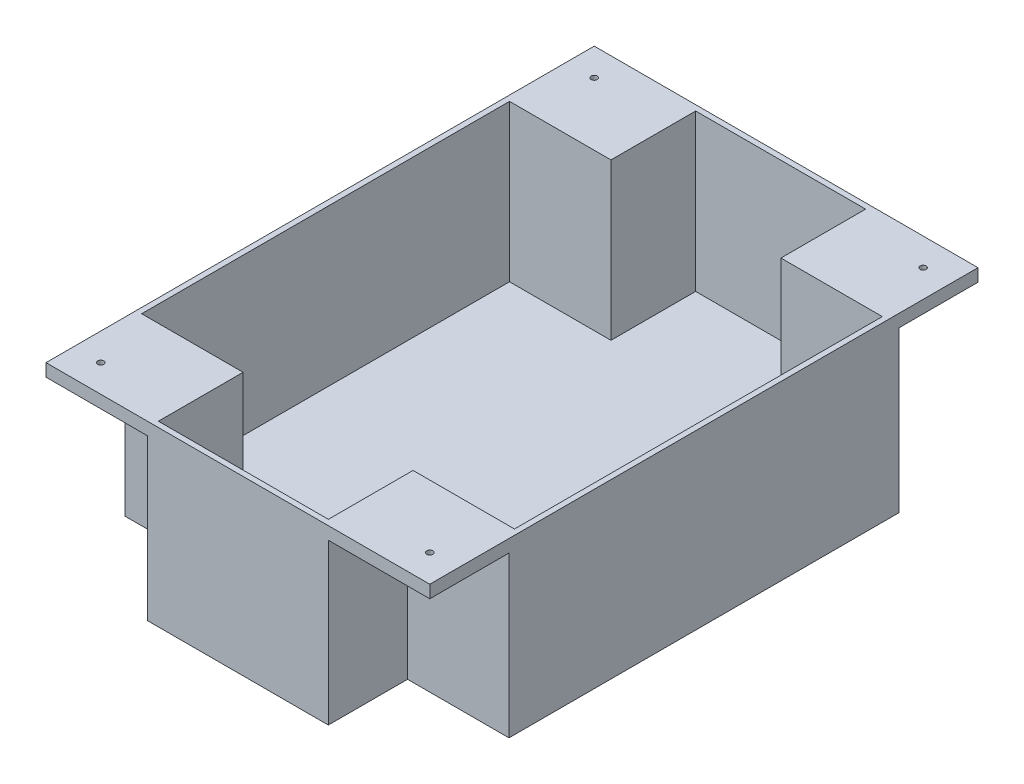
ISO-10303-21;
HEADER;
FILE_DESCRIPTION(('STEP AP214'),'2;1');
FILE_NAME('part.step','',(''),(''),'','','');
FILE_SCHEMA(('AUTOMOTIVE_DESIGN { 1 0 10303 214 1 1 1 1 }'));
ENDSEC;
DATA;
#1=APPLICATION_CONTEXT('core data for automotive mechanical design processes');
#2=APPLICATION_PROTOCOL_DEFINITION('international standard','automotive_design',2000,#1);
#3=PRODUCT_CONTEXT('',#1,'mechanical');
#4=PRODUCT('Part','Part','',(#3));
#5=PRODUCT_RELATED_PRODUCT_CATEGORY('part','',(#4));
#6=PRODUCT_DEFINITION_FORMATION('','',#4);
#7=PRODUCT_DEFINITION_CONTEXT('part definition',#1,'design');
#8=PRODUCT_DEFINITION('design','',#6,#7);
#9=PRODUCT_DEFINITION_SHAPE('','',#8);
#10=(LENGTH_UNIT() NAMED_UNIT(*) SI_UNIT(.MILLI.,.METRE.));
#11=(NAMED_UNIT(*) PLANE_ANGLE_UNIT() SI_UNIT($,.RADIAN.));
#12=(NAMED_UNIT(*) SI_UNIT($,.STERADIAN.) SOLID_ANGLE_UNIT());
#13=UNCERTAINTY_MEASURE_WITH_UNIT(LENGTH_MEASURE(1.E-05),#10,'distance_accuracy_value','');
#14=(GEOMETRIC_REPRESENTATION_CONTEXT(3) GLOBAL_UNCERTAINTY_ASSIGNED_CONTEXT((#13)) GLOBAL_UNIT_ASSIGNED_CONTEXT((#10,
#11,#12)) REPRESENTATION_CONTEXT('',''));
#15=CARTESIAN_POINT('',(0.,0.,0.));
#16=DIRECTION('',(0.,0.,1.));
#17=DIRECTION('',(1.,0.,0.));
#18=AXIS2_PLACEMENT_3D('',#15,#16,#17);
#19=CARTESIAN_POINT('',(35.,3.,50.));
#20=DIRECTION('',(-1.,0.,0.));
#21=DIRECTION('',(0.,0.,1.));
#22=AXIS2_PLACEMENT_3D('',#19,#20,#21);
#23=PLANE('',#22);
#24=DIRECTION('',(0.,0.,1.));
#25=VECTOR('',#24,1.);
#26=CARTESIAN_POINT('',(35.,29.2,-50.));
#27=LINE('',#26,#25);
#28=CARTESIAN_POINT('',(35.,29.2,-50.));
#29=VERTEX_POINT('',#28);
#30=CARTESIAN_POINT('',(35.,29.2,-35.55));
#31=VERTEX_POINT('',#30);
#32=EDGE_CURVE('E925',#29,#31,#27,.T.);
#33=ORIENTED_EDGE('',*,*,#32,.F.);
#34=DIRECTION('',(0.,-1.,0.));
#35=VECTOR('',#34,1.);
#36=CARTESIAN_POINT('',(35.,3.,-50.));
#37=LINE('',#36,#35);
#38=CARTESIAN_POINT('',(35.,31.5,-50.));
#39=VERTEX_POINT('',#38);
#40=EDGE_CURVE('E11',#39,#29,#37,.T.);
#41=ORIENTED_EDGE('',*,*,#40,.F.);
#42=DIRECTION('',(0.,0.,-1.));
#43=VECTOR('',#42,1.);
#44=CARTESIAN_POINT('',(35.,31.5,0.));
#45=LINE('',#44,#43);
#46=CARTESIAN_POINT('',(35.,31.5,50.));
#47=VERTEX_POINT('',#46);
#48=EDGE_CURVE('E306',#47,#39,#45,.T.);
#49=ORIENTED_EDGE('',*,*,#48,.F.);
#50=DIRECTION('',(0.,-1.,0.));
#51=VECTOR('',#50,1.);
#52=CARTESIAN_POINT('',(35.,3.,50.));
#53=LINE('',#52,#51);
#54=CARTESIAN_POINT('',(35.,29.2,50.));
#55=VERTEX_POINT('',#54);
#56=EDGE_CURVE('E266',#47,#55,#53,.T.);
#57=ORIENTED_EDGE('',*,*,#56,.T.);
#58=DIRECTION('',(0.,0.,1.));
#59=VECTOR('',#58,1.);
#60=CARTESIAN_POINT('',(35.,29.2,50.));
#61=LINE('',#60,#59);
#62=CARTESIAN_POINT('',(35.,29.2,35.55));
#63=VERTEX_POINT('',#62);
#64=EDGE_CURVE('E236',#63,#55,#61,.T.);
#65=ORIENTED_EDGE('',*,*,#64,.F.);
#66=DIRECTION('',(0.,-1.,0.));
#67=VECTOR('',#66,1.);
#68=CARTESIAN_POINT('',(35.,29.2,35.55));
#69=LINE('',#68,#67);
#70=CARTESIAN_POINT('',(35.,0.,35.55));
#71=VERTEX_POINT('',#70);
#72=EDGE_CURVE('E233',#63,#71,#69,.T.);
#73=ORIENTED_EDGE('',*,*,#72,.T.);
#74=DIRECTION('',(0.,0.,-1.));
#75=VECTOR('',#74,1.);
#76=CARTESIAN_POINT('',(35.,0.,50.));
#77=LINE('',#76,#75);
#78=CARTESIAN_POINT('',(35.,0.,-35.55));
#79=VERTEX_POINT('',#78);
#80=EDGE_CURVE('E244',#71,#79,#77,.T.);
#81=ORIENTED_EDGE('',*,*,#80,.T.);
#82=DIRECTION('',(0.,-1.,0.));
#83=VECTOR('',#82,1.);
#84=CARTESIAN_POINT('',(35.,29.2,-35.55));
#85=LINE('',#84,#83);
#86=EDGE_CURVE('E904',#31,#79,#85,.T.);
#87=ORIENTED_EDGE('',*,*,#86,.F.);
#88=EDGE_LOOP('',(#33,#41,#49,#57,#65,#73,#81,#87));
#89=FACE_BOUND('',#88,.T.);
#90=ADVANCED_FACE('F41',(#89),#23,.F.);
#91=CARTESIAN_POINT('',(-35.,3.,-50.));
#92=DIRECTION('',(0.,0.,1.));
#93=DIRECTION('',(1.,0.,0.));
#94=AXIS2_PLACEMENT_3D('',#91,#92,#93);
#95=PLANE('',#94);
#96=DIRECTION('',(1.,0.,0.));
#97=VECTOR('',#96,1.);
#98=CARTESIAN_POINT('',(-35.,29.2,-50.));
#99=LINE('',#98,#97);
#100=CARTESIAN_POINT('',(-35.,29.2,-50.));
#101=VERTEX_POINT('',#100);
#102=CARTESIAN_POINT('',(-16.5,29.2,-50.));
#103=VERTEX_POINT('',#102);
#104=EDGE_CURVE('E879',#101,#103,#99,.T.);
#105=ORIENTED_EDGE('',*,*,#104,.F.);
#106=DIRECTION('',(0.,-1.,0.));
#107=VECTOR('',#106,1.);
#108=CARTESIAN_POINT('',(-35.,3.,-50.));
#109=LINE('',#108,#107);
#110=CARTESIAN_POINT('',(-35.,31.5,-50.));
#111=VERTEX_POINT('',#110);
#112=EDGE_CURVE('E47',#111,#101,#109,.T.);
#113=ORIENTED_EDGE('',*,*,#112,.F.);
#114=DIRECTION('',(-1.,0.,0.));
#115=VECTOR('',#114,1.);
#116=CARTESIAN_POINT('',(0.,31.5,-50.));
#117=LINE('',#116,#115);
#118=EDGE_CURVE('E313',#39,#111,#117,.T.);
#119=ORIENTED_EDGE('',*,*,#118,.F.);
#120=ORIENTED_EDGE('',*,*,#40,.T.);
#121=DIRECTION('',(1.,0.,0.));
#122=VECTOR('',#121,1.);
#123=CARTESIAN_POINT('',(35.,29.2,-50.));
#124=LINE('',#123,#122);
#125=CARTESIAN_POINT('',(16.5,29.2,-50.));
#126=VERTEX_POINT('',#125);
#127=EDGE_CURVE('E914',#126,#29,#124,.T.);
#128=ORIENTED_EDGE('',*,*,#127,.F.);
#129=DIRECTION('',(0.,-1.,0.));
#130=VECTOR('',#129,1.);
#131=CARTESIAN_POINT('',(16.5,29.2,-50.));
#132=LINE('',#131,#130);
#133=CARTESIAN_POINT('',(16.5,0.,-50.));
#134=VERTEX_POINT('',#133);
#135=EDGE_CURVE('E906',#126,#134,#132,.T.);
#136=ORIENTED_EDGE('',*,*,#135,.T.);
#137=DIRECTION('',(-1.,0.,0.));
#138=VECTOR('',#137,1.);
#139=CARTESIAN_POINT('',(-35.,0.,-50.));
#140=LINE('',#139,#138);
#141=CARTESIAN_POINT('',(-16.5,0.,-50.));
#142=VERTEX_POINT('',#141);
#143=EDGE_CURVE('E246',#134,#142,#140,.T.);
#144=ORIENTED_EDGE('',*,*,#143,.T.);
#145=DIRECTION('',(0.,-1.,0.));
#146=VECTOR('',#145,1.);
#147=CARTESIAN_POINT('',(-16.5,29.2,-50.));
#148=LINE('',#147,#146);
#149=EDGE_CURVE('E882',#103,#142,#148,.T.);
#150=ORIENTED_EDGE('',*,*,#149,.F.);
#151=EDGE_LOOP('',(#105,#113,#119,#120,#128,#136,#144,#150));
#152=FACE_BOUND('',#151,.T.);
#153=ADVANCED_FACE('F462',(#152),#95,.F.);
#154=CARTESIAN_POINT('',(-35.,3.,50.));
#155=DIRECTION('',(1.,0.,0.));
#156=DIRECTION('',(0.,0.,-1.));
#157=AXIS2_PLACEMENT_3D('',#154,#155,#156);
#158=PLANE('',#157);
#159=DIRECTION('',(0.,0.,-1.));
#160=VECTOR('',#159,1.);
#161=CARTESIAN_POINT('',(-35.,29.2,-50.));
#162=LINE('',#161,#160);
#163=CARTESIAN_POINT('',(-35.,29.2,-35.55));
#164=VERTEX_POINT('',#163);
#165=EDGE_CURVE('E884',#164,#101,#162,.T.);
#166=ORIENTED_EDGE('',*,*,#165,.F.);
#167=DIRECTION('',(0.,-1.,0.));
#168=VECTOR('',#167,1.);
#169=CARTESIAN_POINT('',(-35.,29.2,-35.55));
#170=LINE('',#169,#168);
#171=CARTESIAN_POINT('',(-35.,0.,-35.55));
#172=VERTEX_POINT('',#171);
#173=EDGE_CURVE('E927',#164,#172,#170,.T.);
#174=ORIENTED_EDGE('',*,*,#173,.T.);
#175=DIRECTION('',(0.,0.,1.));
#176=VECTOR('',#175,1.);
#177=CARTESIAN_POINT('',(-35.,0.,50.));
#178=LINE('',#177,#176);
#179=CARTESIAN_POINT('',(-35.,0.,35.55));
#180=VERTEX_POINT('',#179);
#181=EDGE_CURVE('E255',#172,#180,#178,.T.);
#182=ORIENTED_EDGE('',*,*,#181,.T.);
#183=DIRECTION('',(0.,-1.,0.));
#184=VECTOR('',#183,1.);
#185=CARTESIAN_POINT('',(-35.,29.2,35.55));
#186=LINE('',#185,#184);
#187=CARTESIAN_POINT('',(-35.,29.2,35.55));
#188=VERTEX_POINT('',#187);
#189=EDGE_CURVE('E840',#188,#180,#186,.T.);
#190=ORIENTED_EDGE('',*,*,#189,.F.);
#191=DIRECTION('',(0.,0.,-1.));
#192=VECTOR('',#191,1.);
#193=CARTESIAN_POINT('',(-35.,29.2,50.));
#194=LINE('',#193,#192);
#195=CARTESIAN_POINT('',(-35.,29.2,50.));
#196=VERTEX_POINT('',#195);
#197=EDGE_CURVE('E849',#196,#188,#194,.T.);
#198=ORIENTED_EDGE('',*,*,#197,.F.);
#199=DIRECTION('',(0.,-1.,0.));
#200=VECTOR('',#199,1.);
#201=CARTESIAN_POINT('',(-35.,3.,50.));
#202=LINE('',#201,#200);
#203=CARTESIAN_POINT('',(-35.,31.5,50.));
#204=VERTEX_POINT('',#203);
#205=EDGE_CURVE('E268',#204,#196,#202,.T.);
#206=ORIENTED_EDGE('',*,*,#205,.F.);
#207=DIRECTION('',(0.,0.,1.));
#208=VECTOR('',#207,1.);
#209=CARTESIAN_POINT('',(-35.,31.5,0.));
#210=LINE('',#209,#208);
#211=EDGE_CURVE('E303',#111,#204,#210,.T.);
#212=ORIENTED_EDGE('',*,*,#211,.F.);
#213=ORIENTED_EDGE('',*,*,#112,.T.);
#214=EDGE_LOOP('',(#166,#174,#182,#190,#198,#206,#212,#213));
#215=FACE_BOUND('',#214,.T.);
#216=ADVANCED_FACE('F467',(#215),#158,.F.);
#217=CARTESIAN_POINT('',(-35.,3.,50.));
#218=DIRECTION('',(0.,0.,-1.));
#219=DIRECTION('',(-1.,0.,0.));
#220=AXIS2_PLACEMENT_3D('',#217,#218,#219);
#221=PLANE('',#220);
#222=DIRECTION('',(-1.,0.,0.));
#223=VECTOR('',#222,1.);
#224=CARTESIAN_POINT('',(35.,29.2,50.));
#225=LINE('',#224,#223);
#226=CARTESIAN_POINT('',(16.5,29.2,50.));
#227=VERTEX_POINT('',#226);
#228=EDGE_CURVE('E876',#55,#227,#225,.T.);
#229=ORIENTED_EDGE('',*,*,#228,.F.);
#230=ORIENTED_EDGE('',*,*,#56,.F.);
#231=DIRECTION('',(1.,0.,0.));
#232=VECTOR('',#231,1.);
#233=CARTESIAN_POINT('',(0.,31.5,50.));
#234=LINE('',#233,#232);
#235=EDGE_CURVE('E305',#204,#47,#234,.T.);
#236=ORIENTED_EDGE('',*,*,#235,.F.);
#237=ORIENTED_EDGE('',*,*,#205,.T.);
#238=DIRECTION('',(-1.,0.,0.));
#239=VECTOR('',#238,1.);
#240=CARTESIAN_POINT('',(-35.,29.2,50.));
#241=LINE('',#240,#239);
#242=CARTESIAN_POINT('',(-16.5,29.2,50.));
#243=VERTEX_POINT('',#242);
#244=EDGE_CURVE('E856',#243,#196,#241,.T.);
#245=ORIENTED_EDGE('',*,*,#244,.F.);
#246=DIRECTION('',(0.,-1.,0.));
#247=VECTOR('',#246,1.);
#248=CARTESIAN_POINT('',(-16.5,29.2,50.));
#249=LINE('',#248,#247);
#250=CARTESIAN_POINT('',(-16.5,0.,50.));
#251=VERTEX_POINT('',#250);
#252=EDGE_CURVE('E280',#243,#251,#249,.T.);
#253=ORIENTED_EDGE('',*,*,#252,.T.);
#254=DIRECTION('',(1.,0.,0.));
#255=VECTOR('',#254,1.);
#256=CARTESIAN_POINT('',(-35.,0.,50.));
#257=LINE('',#256,#255);
#258=CARTESIAN_POINT('',(16.5,0.,50.));
#259=VERTEX_POINT('',#258);
#260=EDGE_CURVE('E263',#251,#259,#257,.T.);
#261=ORIENTED_EDGE('',*,*,#260,.T.);
#262=DIRECTION('',(0.,-1.,0.));
#263=VECTOR('',#262,1.);
#264=CARTESIAN_POINT('',(16.5,29.2,50.));
#265=LINE('',#264,#263);
#266=EDGE_CURVE('E892',#227,#259,#265,.T.);
#267=ORIENTED_EDGE('',*,*,#266,.F.);
#268=EDGE_LOOP('',(#229,#230,#236,#237,#245,#253,#261,#267));
#269=FACE_BOUND('',#268,.T.);
#270=ADVANCED_FACE('F471',(#269),#221,.F.);
#271=CARTESIAN_POINT('',(-30.,31.5,45.));
#272=DIRECTION('',(0.,-1.,0.));
#273=DIRECTION('',(0.,0.,-1.));
#274=AXIS2_PLACEMENT_3D('',#271,#272,#273);
#275=CYLINDRICAL_SURFACE('',#274,0.560000000000004);
#276=CARTESIAN_POINT('',(-30.,31.5,45.));
#277=DIRECTION('',(0.,-1.,0.));
#278=DIRECTION('',(0.,0.,1.));
#279=AXIS2_PLACEMENT_3D('',#276,#277,#278);
#280=CIRCLE('',#279,0.560000000000004);
#281=CARTESIAN_POINT('',(-30.,31.5,45.56));
#282=VERTEX_POINT('',#281);
#283=EDGE_CURVE('E300',#282,#282,#280,.T.);
#284=ORIENTED_EDGE('',*,*,#283,.F.);
#285=EDGE_LOOP('',(#284));
#286=FACE_BOUND('',#285,.T.);
#287=CARTESIAN_POINT('',(-30.,29.2,45.));
#288=DIRECTION('',(0.,-1.,0.));
#289=DIRECTION('',(0.,0.,-1.));
#290=AXIS2_PLACEMENT_3D('',#287,#288,#289);
#291=CIRCLE('',#290,0.560000000000004);
#292=CARTESIAN_POINT('',(-30.,29.2,44.44));
#293=VERTEX_POINT('',#292);
#294=EDGE_CURVE('E42',#293,#293,#291,.F.);
#295=ORIENTED_EDGE('',*,*,#294,.F.);
#296=EDGE_LOOP('',(#295));
#297=FACE_BOUND('',#296,.T.);
#298=ADVANCED_FACE('F477',(#286,#297),#275,.F.);
#299=CARTESIAN_POINT('',(0.,0.,0.));
#300=DIRECTION('',(0.,-1.,0.));
#301=DIRECTION('',(0.,0.,-1.));
#302=AXIS2_PLACEMENT_3D('',#299,#300,#301);
#303=PLANE('',#302);
#304=DIRECTION('',(0.,0.,1.));
#305=VECTOR('',#304,1.);
#306=CARTESIAN_POINT('',(-16.5,0.,-50.));
#307=LINE('',#306,#305);
#308=CARTESIAN_POINT('',(-16.5,0.,-35.55));
#309=VERTEX_POINT('',#308);
#310=EDGE_CURVE('E60',#142,#309,#307,.T.);
#311=ORIENTED_EDGE('',*,*,#310,.F.);
#312=ORIENTED_EDGE('',*,*,#143,.F.);
#313=DIRECTION('',(0.,0.,-1.));
#314=VECTOR('',#313,1.);
#315=CARTESIAN_POINT('',(16.5,0.,-50.));
#316=LINE('',#315,#314);
#317=CARTESIAN_POINT('',(16.5,0.,-35.55));
#318=VERTEX_POINT('',#317);
#319=EDGE_CURVE('E911',#318,#134,#316,.T.);
#320=ORIENTED_EDGE('',*,*,#319,.F.);
#321=DIRECTION('',(-1.,0.,0.));
#322=VECTOR('',#321,1.);
#323=CARTESIAN_POINT('',(35.,0.,-35.55));
#324=LINE('',#323,#322);
#325=EDGE_CURVE('E64',#79,#318,#324,.T.);
#326=ORIENTED_EDGE('',*,*,#325,.F.);
#327=ORIENTED_EDGE('',*,*,#80,.F.);
#328=DIRECTION('',(1.,0.,0.));
#329=VECTOR('',#328,1.);
#330=CARTESIAN_POINT('',(35.,0.,35.55));
#331=LINE('',#330,#329);
#332=CARTESIAN_POINT('',(16.5,0.,35.55));
#333=VERTEX_POINT('',#332);
#334=EDGE_CURVE('E230',#333,#71,#331,.T.);
#335=ORIENTED_EDGE('',*,*,#334,.F.);
#336=DIRECTION('',(0.,0.,-1.));
#337=VECTOR('',#336,1.);
#338=CARTESIAN_POINT('',(16.5,0.,50.));
#339=LINE('',#338,#337);
#340=EDGE_CURVE('E240',#259,#333,#339,.T.);
#341=ORIENTED_EDGE('',*,*,#340,.F.);
#342=ORIENTED_EDGE('',*,*,#260,.F.);
#343=DIRECTION('',(0.,0.,1.));
#344=VECTOR('',#343,1.);
#345=CARTESIAN_POINT('',(-16.5,0.,50.));
#346=LINE('',#345,#344);
#347=CARTESIAN_POINT('',(-16.5,0.,35.55));
#348=VERTEX_POINT('',#347);
#349=EDGE_CURVE('E845',#348,#251,#346,.T.);
#350=ORIENTED_EDGE('',*,*,#349,.F.);
#351=DIRECTION('',(1.,0.,0.));
#352=VECTOR('',#351,1.);
#353=CARTESIAN_POINT('',(-35.,0.,35.55));
#354=LINE('',#353,#352);
#355=EDGE_CURVE('E833',#180,#348,#354,.T.);
#356=ORIENTED_EDGE('',*,*,#355,.F.);
#357=ORIENTED_EDGE('',*,*,#181,.F.);
#358=DIRECTION('',(-1.,0.,0.));
#359=VECTOR('',#358,1.);
#360=CARTESIAN_POINT('',(-35.,0.,-35.55));
#361=LINE('',#360,#359);
#362=EDGE_CURVE('E886',#309,#172,#361,.T.);
#363=ORIENTED_EDGE('',*,*,#362,.F.);
#364=EDGE_LOOP('',(#311,#312,#320,#326,#327,#335,#341,#342,#350,#356,#357,#363));
#365=FACE_BOUND('',#364,.T.);
#366=ADVANCED_FACE('F247',(#365),#303,.T.);
#367=CARTESIAN_POINT('',(0.,31.5,-33.55));
#368=DIRECTION('',(0.,0.,1.));
#369=DIRECTION('',(1.,0.,0.));
#370=AXIS2_PLACEMENT_3D('',#367,#368,#369);
#371=PLANE('',#370);
#372=DIRECTION('',(-1.,0.,0.));
#373=VECTOR('',#372,1.);
#374=CARTESIAN_POINT('',(0.,3.,-33.55));
#375=LINE('',#374,#373);
#376=CARTESIAN_POINT('',(34.,3.,-33.55));
#377=VERTEX_POINT('',#376);
#378=CARTESIAN_POINT('',(15.5,3.,-33.55));
#379=VERTEX_POINT('',#378);
#380=EDGE_CURVE('E299',#377,#379,#375,.T.);
#381=ORIENTED_EDGE('',*,*,#380,.F.);
#382=DIRECTION('',(0.,-1.,0.));
#383=VECTOR('',#382,1.);
#384=CARTESIAN_POINT('',(34.,31.5,-33.55));
#385=LINE('',#384,#383);
#386=CARTESIAN_POINT('',(34.,31.5,-33.55));
#387=VERTEX_POINT('',#386);
#388=EDGE_CURVE('E253',#387,#377,#385,.T.);
#389=ORIENTED_EDGE('',*,*,#388,.F.);
#390=DIRECTION('',(-1.,0.,0.));
#391=VECTOR('',#390,1.);
#392=CARTESIAN_POINT('',(0.,31.5,-33.55));
#393=LINE('',#392,#391);
#394=CARTESIAN_POINT('',(15.5,31.5,-33.55));
#395=VERTEX_POINT('',#394);
#396=EDGE_CURVE('E314',#387,#395,#393,.T.);
#397=ORIENTED_EDGE('',*,*,#396,.T.);
#398=DIRECTION('',(0.,-1.,0.));
#399=VECTOR('',#398,1.);
#400=CARTESIAN_POINT('',(15.5,31.5,-33.55));
#401=LINE('',#400,#399);
#402=EDGE_CURVE('E346',#395,#379,#401,.T.);
#403=ORIENTED_EDGE('',*,*,#402,.T.);
#404=EDGE_LOOP('',(#381,#389,#397,#403));
#405=FACE_BOUND('',#404,.T.);
#406=ADVANCED_FACE('F426',(#405),#371,.T.);
#407=CARTESIAN_POINT('',(34.,31.5,0.));
#408=DIRECTION('',(1.,0.,0.));
#409=DIRECTION('',(0.,0.,-1.));
#410=AXIS2_PLACEMENT_3D('',#407,#408,#409);
#411=PLANE('',#410);
#412=DIRECTION('',(0.,0.,1.));
#413=VECTOR('',#412,1.);
#414=CARTESIAN_POINT('',(34.,3.,0.));
#415=LINE('',#414,#413);
#416=CARTESIAN_POINT('',(34.,3.,33.55));
#417=VERTEX_POINT('',#416);
#418=EDGE_CURVE('E348',#377,#417,#415,.T.);
#419=ORIENTED_EDGE('',*,*,#418,.T.);
#420=DIRECTION('',(0.,-1.,0.));
#421=VECTOR('',#420,1.);
#422=CARTESIAN_POINT('',(34.,31.5,33.55));
#423=LINE('',#422,#421);
#424=CARTESIAN_POINT('',(34.,31.5,33.55));
#425=VERTEX_POINT('',#424);
#426=EDGE_CURVE('E260',#425,#417,#423,.T.);
#427=ORIENTED_EDGE('',*,*,#426,.F.);
#428=DIRECTION('',(0.,0.,1.));
#429=VECTOR('',#428,1.);
#430=CARTESIAN_POINT('',(34.,31.5,0.));
#431=LINE('',#430,#429);
#432=EDGE_CURVE('E320',#387,#425,#431,.T.);
#433=ORIENTED_EDGE('',*,*,#432,.F.);
#434=ORIENTED_EDGE('',*,*,#388,.T.);
#435=EDGE_LOOP('',(#419,#427,#433,#434));
#436=FACE_BOUND('',#435,.T.);
#437=ADVANCED_FACE('F412',(#436),#411,.F.);
#438=CARTESIAN_POINT('',(0.,31.5,33.55));
#439=DIRECTION('',(0.,0.,1.));
#440=DIRECTION('',(1.,0.,0.));
#441=AXIS2_PLACEMENT_3D('',#438,#439,#440);
#442=PLANE('',#441);
#443=DIRECTION('',(-1.,0.,0.));
#444=VECTOR('',#443,1.);
#445=CARTESIAN_POINT('',(0.,3.,33.55));
#446=LINE('',#445,#444);
#447=CARTESIAN_POINT('',(15.5,3.,33.55));
#448=VERTEX_POINT('',#447);
#449=EDGE_CURVE('E352',#417,#448,#446,.T.);
#450=ORIENTED_EDGE('',*,*,#449,.T.);
#451=DIRECTION('',(0.,-1.,0.));
#452=VECTOR('',#451,1.);
#453=CARTESIAN_POINT('',(15.5,31.5,33.55));
#454=LINE('',#453,#452);
#455=CARTESIAN_POINT('',(15.5,31.5,33.55));
#456=VERTEX_POINT('',#455);
#457=EDGE_CURVE('E404',#456,#448,#454,.T.);
#458=ORIENTED_EDGE('',*,*,#457,.F.);
#459=DIRECTION('',(-1.,0.,0.));
#460=VECTOR('',#459,1.);
#461=CARTESIAN_POINT('',(0.,31.5,33.55));
#462=LINE('',#461,#460);
#463=EDGE_CURVE('E319',#425,#456,#462,.T.);
#464=ORIENTED_EDGE('',*,*,#463,.F.);
#465=ORIENTED_EDGE('',*,*,#426,.T.);
#466=EDGE_LOOP('',(#450,#458,#464,#465));
#467=FACE_BOUND('',#466,.T.);
#468=ADVANCED_FACE('F408',(#467),#442,.F.);
#469=CARTESIAN_POINT('',(15.5,31.5,0.));
#470=DIRECTION('',(1.,0.,0.));
#471=DIRECTION('',(0.,0.,-1.));
#472=AXIS2_PLACEMENT_3D('',#469,#470,#471);
#473=PLANE('',#472);
#474=DIRECTION('',(0.,0.,1.));
#475=VECTOR('',#474,1.);
#476=CARTESIAN_POINT('',(15.5,3.,0.));
#477=LINE('',#476,#475);
#478=CARTESIAN_POINT('',(15.5,3.,49.));
#479=VERTEX_POINT('',#478);
#480=EDGE_CURVE('E358',#448,#479,#477,.T.);
#481=ORIENTED_EDGE('',*,*,#480,.T.);
#482=DIRECTION('',(0.,-1.,0.));
#483=VECTOR('',#482,1.);
#484=CARTESIAN_POINT('',(15.5,31.5,49.));
#485=LINE('',#484,#483);
#486=CARTESIAN_POINT('',(15.5,31.5,49.));
#487=VERTEX_POINT('',#486);
#488=EDGE_CURVE('E402',#487,#479,#485,.T.);
#489=ORIENTED_EDGE('',*,*,#488,.F.);
#490=DIRECTION('',(0.,0.,1.));
#491=VECTOR('',#490,1.);
#492=CARTESIAN_POINT('',(15.5,31.5,0.));
#493=LINE('',#492,#491);
#494=EDGE_CURVE('E323',#456,#487,#493,.T.);
#495=ORIENTED_EDGE('',*,*,#494,.F.);
#496=ORIENTED_EDGE('',*,*,#457,.T.);
#497=EDGE_LOOP('',(#481,#489,#495,#496));
#498=FACE_BOUND('',#497,.T.);
#499=ADVANCED_FACE('F420',(#498),#473,.F.);
#500=CARTESIAN_POINT('',(0.,31.5,49.));
#501=DIRECTION('',(0.,0.,1.));
#502=DIRECTION('',(1.,0.,0.));
#503=AXIS2_PLACEMENT_3D('',#500,#501,#502);
#504=PLANE('',#503);
#505=DIRECTION('',(-1.,0.,0.));
#506=VECTOR('',#505,1.);
#507=CARTESIAN_POINT('',(0.,3.,49.));
#508=LINE('',#507,#506);
#509=CARTESIAN_POINT('',(-15.5,3.,49.));
#510=VERTEX_POINT('',#509);
#511=EDGE_CURVE('E360',#479,#510,#508,.T.);
#512=ORIENTED_EDGE('',*,*,#511,.T.);
#513=DIRECTION('',(0.,-1.,0.));
#514=VECTOR('',#513,1.);
#515=CARTESIAN_POINT('',(-15.5,31.5,49.));
#516=LINE('',#515,#514);
#517=CARTESIAN_POINT('',(-15.5,31.5,49.));
#518=VERTEX_POINT('',#517);
#519=EDGE_CURVE('E397',#518,#510,#516,.T.);
#520=ORIENTED_EDGE('',*,*,#519,.F.);
#521=DIRECTION('',(-1.,0.,0.));
#522=VECTOR('',#521,1.);
#523=CARTESIAN_POINT('',(0.,31.5,49.));
#524=LINE('',#523,#522);
#525=EDGE_CURVE('E326',#487,#518,#524,.T.);
#526=ORIENTED_EDGE('',*,*,#525,.F.);
#527=ORIENTED_EDGE('',*,*,#488,.T.);
#528=EDGE_LOOP('',(#512,#520,#526,#527));
#529=FACE_BOUND('',#528,.T.);
#530=ADVANCED_FACE('F452',(#529),#504,.F.);
#531=CARTESIAN_POINT('',(-15.5,31.5,0.));
#532=DIRECTION('',(1.,0.,0.));
#533=DIRECTION('',(0.,0.,-1.));
#534=AXIS2_PLACEMENT_3D('',#531,#532,#533);
#535=PLANE('',#534);
#536=DIRECTION('',(0.,0.,1.));
#537=VECTOR('',#536,1.);
#538=CARTESIAN_POINT('',(-15.5,3.,0.));
#539=LINE('',#538,#537);
#540=CARTESIAN_POINT('',(-15.5,3.,33.55));
#541=VERTEX_POINT('',#540);
#542=EDGE_CURVE('E362',#541,#510,#539,.T.);
#543=ORIENTED_EDGE('',*,*,#542,.F.);
#544=DIRECTION('',(0.,-1.,0.));
#545=VECTOR('',#544,1.);
#546=CARTESIAN_POINT('',(-15.5,31.5,33.55));
#547=LINE('',#546,#545);
#548=CARTESIAN_POINT('',(-15.5,31.5,33.55));
#549=VERTEX_POINT('',#548);
#550=EDGE_CURVE('E394',#549,#541,#547,.T.);
#551=ORIENTED_EDGE('',*,*,#550,.F.);
#552=DIRECTION('',(0.,0.,1.));
#553=VECTOR('',#552,1.);
#554=CARTESIAN_POINT('',(-15.5,31.5,0.));
#555=LINE('',#554,#553);
#556=EDGE_CURVE('E327',#549,#518,#555,.T.);
#557=ORIENTED_EDGE('',*,*,#556,.T.);
#558=ORIENTED_EDGE('',*,*,#519,.T.);
#559=EDGE_LOOP('',(#543,#551,#557,#558));
#560=FACE_BOUND('',#559,.T.);
#561=ADVANCED_FACE('F449',(#560),#535,.T.);
#562=CARTESIAN_POINT('',(0.,31.5,33.55));
#563=DIRECTION('',(0.,0.,-1.));
#564=DIRECTION('',(-1.,0.,0.));
#565=AXIS2_PLACEMENT_3D('',#562,#563,#564);
#566=PLANE('',#565);
#567=DIRECTION('',(1.,0.,0.));
#568=VECTOR('',#567,1.);
#569=CARTESIAN_POINT('',(0.,3.,33.55));
#570=LINE('',#569,#568);
#571=CARTESIAN_POINT('',(-34.,3.,33.55));
#572=VERTEX_POINT('',#571);
#573=EDGE_CURVE('E365',#572,#541,#570,.T.);
#574=ORIENTED_EDGE('',*,*,#573,.F.);
#575=DIRECTION('',(0.,-1.,0.));
#576=VECTOR('',#575,1.);
#577=CARTESIAN_POINT('',(-34.,31.5,33.55));
#578=LINE('',#577,#576);
#579=CARTESIAN_POINT('',(-34.,31.5,33.55));
#580=VERTEX_POINT('',#579);
#581=EDGE_CURVE('E395',#580,#572,#578,.T.);
#582=ORIENTED_EDGE('',*,*,#581,.F.);
#583=DIRECTION('',(1.,0.,0.));
#584=VECTOR('',#583,1.);
#585=CARTESIAN_POINT('',(0.,31.5,33.55));
#586=LINE('',#585,#584);
#587=EDGE_CURVE('E332',#580,#549,#586,.T.);
#588=ORIENTED_EDGE('',*,*,#587,.T.);
#589=ORIENTED_EDGE('',*,*,#550,.T.);
#590=EDGE_LOOP('',(#574,#582,#588,#589));
#591=FACE_BOUND('',#590,.T.);
#592=ADVANCED_FACE('F446',(#591),#566,.T.);
#593=CARTESIAN_POINT('',(-34.,31.5,0.));
#594=DIRECTION('',(-1.,0.,0.));
#595=DIRECTION('',(0.,0.,1.));
#596=AXIS2_PLACEMENT_3D('',#593,#594,#595);
#597=PLANE('',#596);
#598=DIRECTION('',(0.,0.,-1.));
#599=VECTOR('',#598,1.);
#600=CARTESIAN_POINT('',(-34.,3.,0.));
#601=LINE('',#600,#599);
#602=CARTESIAN_POINT('',(-34.,3.,-33.55));
#603=VERTEX_POINT('',#602);
#604=EDGE_CURVE('E368',#572,#603,#601,.T.);
#605=ORIENTED_EDGE('',*,*,#604,.T.);
#606=DIRECTION('',(0.,-1.,0.));
#607=VECTOR('',#606,1.);
#608=CARTESIAN_POINT('',(-34.,31.5,-33.55));
#609=LINE('',#608,#607);
#610=CARTESIAN_POINT('',(-34.,31.5,-33.55));
#611=VERTEX_POINT('',#610);
#612=EDGE_CURVE('E386',#611,#603,#609,.T.);
#613=ORIENTED_EDGE('',*,*,#612,.F.);
#614=DIRECTION('',(0.,0.,-1.));
#615=VECTOR('',#614,1.);
#616=CARTESIAN_POINT('',(-34.,31.5,0.));
#617=LINE('',#616,#615);
#618=EDGE_CURVE('E331',#580,#611,#617,.T.);
#619=ORIENTED_EDGE('',*,*,#618,.F.);
#620=ORIENTED_EDGE('',*,*,#581,.T.);
#621=EDGE_LOOP('',(#605,#613,#619,#620));
#622=FACE_BOUND('',#621,.T.);
#623=ADVANCED_FACE('F444',(#622),#597,.F.);
#624=CARTESIAN_POINT('',(0.,31.5,-33.55));
#625=DIRECTION('',(0.,0.,-1.));
#626=DIRECTION('',(-1.,0.,0.));
#627=AXIS2_PLACEMENT_3D('',#624,#625,#626);
#628=PLANE('',#627);
#629=DIRECTION('',(1.,0.,0.));
#630=VECTOR('',#629,1.);
#631=CARTESIAN_POINT('',(0.,3.,-33.55));
#632=LINE('',#631,#630);
#633=CARTESIAN_POINT('',(-15.5,3.,-33.55));
#634=VERTEX_POINT('',#633);
#635=EDGE_CURVE('E369',#603,#634,#632,.T.);
#636=ORIENTED_EDGE('',*,*,#635,.T.);
#637=DIRECTION('',(0.,-1.,0.));
#638=VECTOR('',#637,1.);
#639=CARTESIAN_POINT('',(-15.5,31.5,-33.55));
#640=LINE('',#639,#638);
#641=CARTESIAN_POINT('',(-15.5,31.5,-33.55));
#642=VERTEX_POINT('',#641);
#643=EDGE_CURVE('E387',#642,#634,#640,.T.);
#644=ORIENTED_EDGE('',*,*,#643,.F.);
#645=DIRECTION('',(1.,0.,0.));
#646=VECTOR('',#645,1.);
#647=CARTESIAN_POINT('',(0.,31.5,-33.55));
#648=LINE('',#647,#646);
#649=EDGE_CURVE('E340',#611,#642,#648,.T.);
#650=ORIENTED_EDGE('',*,*,#649,.F.);
#651=ORIENTED_EDGE('',*,*,#612,.T.);
#652=EDGE_LOOP('',(#636,#644,#650,#651));
#653=FACE_BOUND('',#652,.T.);
#654=ADVANCED_FACE('F437',(#653),#628,.F.);
#655=CARTESIAN_POINT('',(-15.5,31.5,0.));
#656=DIRECTION('',(-1.,0.,0.));
#657=DIRECTION('',(0.,0.,1.));
#658=AXIS2_PLACEMENT_3D('',#655,#656,#657);
#659=PLANE('',#658);
#660=DIRECTION('',(0.,0.,-1.));
#661=VECTOR('',#660,1.);
#662=CARTESIAN_POINT('',(-15.5,3.,0.));
#663=LINE('',#662,#661);
#664=CARTESIAN_POINT('',(-15.5,3.,-49.));
#665=VERTEX_POINT('',#664);
#666=EDGE_CURVE('E375',#634,#665,#663,.T.);
#667=ORIENTED_EDGE('',*,*,#666,.T.);
#668=DIRECTION('',(0.,-1.,0.));
#669=VECTOR('',#668,1.);
#670=CARTESIAN_POINT('',(-15.5,31.5,-49.));
#671=LINE('',#670,#669);
#672=CARTESIAN_POINT('',(-15.5,31.5,-49.));
#673=VERTEX_POINT('',#672);
#674=EDGE_CURVE('E382',#673,#665,#671,.T.);
#675=ORIENTED_EDGE('',*,*,#674,.F.);
#676=DIRECTION('',(0.,0.,-1.));
#677=VECTOR('',#676,1.);
#678=CARTESIAN_POINT('',(-15.5,31.5,0.));
#679=LINE('',#678,#677);
#680=EDGE_CURVE('E339',#642,#673,#679,.T.);
#681=ORIENTED_EDGE('',*,*,#680,.F.);
#682=ORIENTED_EDGE('',*,*,#643,.T.);
#683=EDGE_LOOP('',(#667,#675,#681,#682));
#684=FACE_BOUND('',#683,.T.);
#685=ADVANCED_FACE('F434',(#684),#659,.F.);
#686=CARTESIAN_POINT('',(0.,31.5,-49.));
#687=DIRECTION('',(0.,0.,1.));
#688=DIRECTION('',(1.,0.,0.));
#689=AXIS2_PLACEMENT_3D('',#686,#687,#688);
#690=PLANE('',#689);
#691=DIRECTION('',(-1.,0.,0.));
#692=VECTOR('',#691,1.);
#693=CARTESIAN_POINT('',(0.,3.,-49.));
#694=LINE('',#693,#692);
#695=CARTESIAN_POINT('',(15.5,3.,-49.));
#696=VERTEX_POINT('',#695);
#697=EDGE_CURVE('E374',#696,#665,#694,.T.);
#698=ORIENTED_EDGE('',*,*,#697,.F.);
#699=DIRECTION('',(0.,-1.,0.));
#700=VECTOR('',#699,1.);
#701=CARTESIAN_POINT('',(15.5,31.5,-49.));
#702=LINE('',#701,#700);
#703=CARTESIAN_POINT('',(15.5,31.5,-49.));
#704=VERTEX_POINT('',#703);
#705=EDGE_CURVE('E379',#704,#696,#702,.T.);
#706=ORIENTED_EDGE('',*,*,#705,.F.);
#707=DIRECTION('',(-1.,0.,0.));
#708=VECTOR('',#707,1.);
#709=CARTESIAN_POINT('',(0.,31.5,-49.));
#710=LINE('',#709,#708);
#711=EDGE_CURVE('E344',#704,#673,#710,.T.);
#712=ORIENTED_EDGE('',*,*,#711,.T.);
#713=ORIENTED_EDGE('',*,*,#674,.T.);
#714=EDGE_LOOP('',(#698,#706,#712,#713));
#715=FACE_BOUND('',#714,.T.);
#716=ADVANCED_FACE('F433',(#715),#690,.T.);
#717=CARTESIAN_POINT('',(15.5,31.5,0.));
#718=DIRECTION('',(-1.,0.,0.));
#719=DIRECTION('',(0.,0.,1.));
#720=AXIS2_PLACEMENT_3D('',#717,#718,#719);
#721=PLANE('',#720);
#722=DIRECTION('',(0.,0.,-1.));
#723=VECTOR('',#722,1.);
#724=CARTESIAN_POINT('',(15.5,3.,0.));
#725=LINE('',#724,#723);
#726=EDGE_CURVE('E301',#379,#696,#725,.T.);
#727=ORIENTED_EDGE('',*,*,#726,.F.);
#728=ORIENTED_EDGE('',*,*,#402,.F.);
#729=DIRECTION('',(0.,0.,-1.));
#730=VECTOR('',#729,1.);
#731=CARTESIAN_POINT('',(15.5,31.5,0.));
#732=LINE('',#731,#730);
#733=EDGE_CURVE('E341',#395,#704,#732,.T.);
#734=ORIENTED_EDGE('',*,*,#733,.T.);
#735=ORIENTED_EDGE('',*,*,#705,.T.);
#736=EDGE_LOOP('',(#727,#728,#734,#735));
#737=FACE_BOUND('',#736,.T.);
#738=ADVANCED_FACE('F427',(#737),#721,.T.);
#739=CARTESIAN_POINT('',(0.,31.5,0.));
#740=DIRECTION('',(0.,1.,0.));
#741=DIRECTION('',(0.,0.,1.));
#742=AXIS2_PLACEMENT_3D('',#739,#740,#741);
#743=PLANE('',#742);
#744=CARTESIAN_POINT('',(30.,31.5,45.));
#745=DIRECTION('',(0.,-1.,0.));
#746=DIRECTION('',(0.,0.,-1.));
#747=AXIS2_PLACEMENT_3D('',#744,#745,#746);
#748=CIRCLE('',#747,0.560000000000004);
#749=CARTESIAN_POINT('',(30.,31.5,44.44));
#750=VERTEX_POINT('',#749);
#751=EDGE_CURVE('E283',#750,#750,#748,.T.);
#752=ORIENTED_EDGE('',*,*,#751,.T.);
#753=EDGE_LOOP('',(#752));
#754=FACE_BOUND('',#753,.T.);
#755=CARTESIAN_POINT('',(30.,31.5,-45.));
#756=DIRECTION('',(0.,-1.,0.));
#757=DIRECTION('',(0.,0.,1.));
#758=AXIS2_PLACEMENT_3D('',#755,#756,#757);
#759=CIRCLE('',#758,0.560000000000004);
#760=CARTESIAN_POINT('',(30.,31.5,-44.44));
#761=VERTEX_POINT('',#760);
#762=EDGE_CURVE('E287',#761,#761,#759,.T.);
#763=ORIENTED_EDGE('',*,*,#762,.T.);
#764=EDGE_LOOP('',(#763));
#765=FACE_BOUND('',#764,.T.);
#766=CARTESIAN_POINT('',(-30.,31.5,-45.));
#767=DIRECTION('',(0.,-1.,0.));
#768=DIRECTION('',(0.,0.,-1.));
#769=AXIS2_PLACEMENT_3D('',#766,#767,#768);
#770=CIRCLE('',#769,0.560000000000004);
#771=CARTESIAN_POINT('',(-30.,31.5,-45.56));
#772=VERTEX_POINT('',#771);
#773=EDGE_CURVE('E291',#772,#772,#770,.T.);
#774=ORIENTED_EDGE('',*,*,#773,.T.);
#775=EDGE_LOOP('',(#774));
#776=FACE_BOUND('',#775,.T.);
#777=ORIENTED_EDGE('',*,*,#283,.T.);
#778=EDGE_LOOP('',(#777));
#779=FACE_BOUND('',#778,.T.);
#780=ORIENTED_EDGE('',*,*,#211,.T.);
#781=ORIENTED_EDGE('',*,*,#235,.T.);
#782=ORIENTED_EDGE('',*,*,#48,.T.);
#783=ORIENTED_EDGE('',*,*,#118,.T.);
#784=EDGE_LOOP('',(#780,#781,#782,#783));
#785=FACE_BOUND('',#784,.T.);
#786=ORIENTED_EDGE('',*,*,#396,.F.);
#787=ORIENTED_EDGE('',*,*,#432,.T.);
#788=ORIENTED_EDGE('',*,*,#463,.T.);
#789=ORIENTED_EDGE('',*,*,#494,.T.);
#790=ORIENTED_EDGE('',*,*,#525,.T.);
#791=ORIENTED_EDGE('',*,*,#556,.F.);
#792=ORIENTED_EDGE('',*,*,#587,.F.);
#793=ORIENTED_EDGE('',*,*,#618,.T.);
#794=ORIENTED_EDGE('',*,*,#649,.T.);
#795=ORIENTED_EDGE('',*,*,#680,.T.);
#796=ORIENTED_EDGE('',*,*,#711,.F.);
#797=ORIENTED_EDGE('',*,*,#733,.F.);
#798=EDGE_LOOP('',(#786,#787,#788,#789,#790,#791,#792,#793,#794,#795,#796,#797));
#799=FACE_BOUND('',#798,.T.);
#800=ADVANCED_FACE('F425',(#754,#765,#776,#779,#785,#799),#743,.T.);
#801=CARTESIAN_POINT('',(0.,3.,0.));
#802=DIRECTION('',(0.,-1.,0.));
#803=DIRECTION('',(0.,0.,-1.));
#804=AXIS2_PLACEMENT_3D('',#801,#802,#803);
#805=PLANE('',#804);
#806=ORIENTED_EDGE('',*,*,#418,.F.);
#807=ORIENTED_EDGE('',*,*,#380,.T.);
#808=ORIENTED_EDGE('',*,*,#726,.T.);
#809=ORIENTED_EDGE('',*,*,#697,.T.);
#810=ORIENTED_EDGE('',*,*,#666,.F.);
#811=ORIENTED_EDGE('',*,*,#635,.F.);
#812=ORIENTED_EDGE('',*,*,#604,.F.);
#813=ORIENTED_EDGE('',*,*,#573,.T.);
#814=ORIENTED_EDGE('',*,*,#542,.T.);
#815=ORIENTED_EDGE('',*,*,#511,.F.);
#816=ORIENTED_EDGE('',*,*,#480,.F.);
#817=ORIENTED_EDGE('',*,*,#449,.F.);
#818=EDGE_LOOP('',(#806,#807,#808,#809,#810,#811,#812,#813,#814,#815,#816,#817));
#819=FACE_BOUND('',#818,.T.);
#820=ADVANCED_FACE('F418',(#819),#805,.F.);
#821=CARTESIAN_POINT('',(-30.,31.5,-45.));
#822=DIRECTION('',(0.,-1.,0.));
#823=DIRECTION('',(0.,0.,-1.));
#824=AXIS2_PLACEMENT_3D('',#821,#822,#823);
#825=CYLINDRICAL_SURFACE('',#824,0.560000000000004);
#826=CARTESIAN_POINT('',(-30.,29.2,-45.));
#827=DIRECTION('',(0.,1.,0.));
#828=DIRECTION('',(0.,0.,1.));
#829=AXIS2_PLACEMENT_3D('',#826,#827,#828);
#830=CIRCLE('',#829,0.560000000000004);
#831=CARTESIAN_POINT('',(-30.,29.2,-44.44));
#832=VERTEX_POINT('',#831);
#833=EDGE_CURVE('E276',#832,#832,#830,.F.);
#834=ORIENTED_EDGE('',*,*,#833,.T.);
#835=EDGE_LOOP('',(#834));
#836=FACE_BOUND('',#835,.T.);
#837=ORIENTED_EDGE('',*,*,#773,.F.);
#838=EDGE_LOOP('',(#837));
#839=FACE_BOUND('',#838,.T.);
#840=ADVANCED_FACE('F486',(#836,#839),#825,.F.);
#841=CARTESIAN_POINT('',(30.,31.5,-45.));
#842=DIRECTION('',(0.,-1.,0.));
#843=DIRECTION('',(0.,0.,-1.));
#844=AXIS2_PLACEMENT_3D('',#841,#842,#843);
#845=CYLINDRICAL_SURFACE('',#844,0.560000000000004);
#846=CARTESIAN_POINT('',(30.,29.2,-45.));
#847=DIRECTION('',(0.,1.,0.));
#848=DIRECTION('',(0.,0.,1.));
#849=AXIS2_PLACEMENT_3D('',#846,#847,#848);
#850=CIRCLE('',#849,0.560000000000004);
#851=CARTESIAN_POINT('',(30.,29.2,-44.44));
#852=VERTEX_POINT('',#851);
#853=EDGE_CURVE('E277',#852,#852,#850,.F.);
#854=ORIENTED_EDGE('',*,*,#853,.T.);
#855=EDGE_LOOP('',(#854));
#856=FACE_BOUND('',#855,.T.);
#857=ORIENTED_EDGE('',*,*,#762,.F.);
#858=EDGE_LOOP('',(#857));
#859=FACE_BOUND('',#858,.T.);
#860=ADVANCED_FACE('F602',(#856,#859),#845,.F.);
#861=CARTESIAN_POINT('',(30.,31.5,45.));
#862=DIRECTION('',(0.,-1.,0.));
#863=DIRECTION('',(0.,0.,-1.));
#864=AXIS2_PLACEMENT_3D('',#861,#862,#863);
#865=CYLINDRICAL_SURFACE('',#864,0.560000000000004);
#866=CARTESIAN_POINT('',(30.,29.2,45.));
#867=DIRECTION('',(0.,1.,0.));
#868=DIRECTION('',(0.,0.,1.));
#869=AXIS2_PLACEMENT_3D('',#866,#867,#868);
#870=CIRCLE('',#869,0.560000000000004);
#871=CARTESIAN_POINT('',(30.,29.2,45.56));
#872=VERTEX_POINT('',#871);
#873=EDGE_CURVE('E272',#872,#872,#870,.F.);
#874=ORIENTED_EDGE('',*,*,#873,.T.);
#875=EDGE_LOOP('',(#874));
#876=FACE_BOUND('',#875,.T.);
#877=ORIENTED_EDGE('',*,*,#751,.F.);
#878=EDGE_LOOP('',(#877));
#879=FACE_BOUND('',#878,.T.);
#880=ADVANCED_FACE('F615',(#876,#879),#865,.F.);
#881=CARTESIAN_POINT('',(0.,29.2,0.));
#882=DIRECTION('',(0.,1.,0.));
#883=DIRECTION('',(0.,0.,1.));
#884=AXIS2_PLACEMENT_3D('',#881,#882,#883);
#885=PLANE('',#884);
#886=ORIENTED_EDGE('',*,*,#64,.T.);
#887=ORIENTED_EDGE('',*,*,#228,.T.);
#888=DIRECTION('',(0.,0.,-1.));
#889=VECTOR('',#888,1.);
#890=CARTESIAN_POINT('',(16.5,29.2,50.));
#891=LINE('',#890,#889);
#892=CARTESIAN_POINT('',(16.5,29.2,35.55));
#893=VERTEX_POINT('',#892);
#894=EDGE_CURVE('E897',#227,#893,#891,.T.);
#895=ORIENTED_EDGE('',*,*,#894,.T.);
#896=DIRECTION('',(1.,0.,0.));
#897=VECTOR('',#896,1.);
#898=CARTESIAN_POINT('',(35.,29.2,35.55));
#899=LINE('',#898,#897);
#900=EDGE_CURVE('E895',#893,#63,#899,.T.);
#901=ORIENTED_EDGE('',*,*,#900,.T.);
#902=EDGE_LOOP('',(#886,#887,#895,#901));
#903=FACE_BOUND('',#902,.T.);
#904=ORIENTED_EDGE('',*,*,#873,.F.);
#905=EDGE_LOOP('',(#904));
#906=FACE_BOUND('',#905,.T.);
#907=ADVANCED_FACE('F625',(#903,#906),#885,.F.);
#908=CARTESIAN_POINT('',(35.,29.2,35.55));
#909=DIRECTION('',(0.,0.,-1.));
#910=DIRECTION('',(-1.,0.,0.));
#911=AXIS2_PLACEMENT_3D('',#908,#909,#910);
#912=PLANE('',#911);
#913=ORIENTED_EDGE('',*,*,#334,.T.);
#914=ORIENTED_EDGE('',*,*,#72,.F.);
#915=ORIENTED_EDGE('',*,*,#900,.F.);
#916=DIRECTION('',(0.,-1.,0.));
#917=VECTOR('',#916,1.);
#918=CARTESIAN_POINT('',(16.5,29.2,35.55));
#919=LINE('',#918,#917);
#920=EDGE_CURVE('E232',#893,#333,#919,.T.);
#921=ORIENTED_EDGE('',*,*,#920,.T.);
#922=EDGE_LOOP('',(#913,#914,#915,#921));
#923=FACE_BOUND('',#922,.T.);
#924=ADVANCED_FACE('F228',(#923),#912,.F.);
#925=CARTESIAN_POINT('',(16.5,29.2,50.));
#926=DIRECTION('',(-1.,0.,0.));
#927=DIRECTION('',(0.,0.,1.));
#928=AXIS2_PLACEMENT_3D('',#925,#926,#927);
#929=PLANE('',#928);
#930=ORIENTED_EDGE('',*,*,#340,.T.);
#931=ORIENTED_EDGE('',*,*,#920,.F.);
#932=ORIENTED_EDGE('',*,*,#894,.F.);
#933=ORIENTED_EDGE('',*,*,#266,.T.);
#934=EDGE_LOOP('',(#930,#931,#932,#933));
#935=FACE_BOUND('',#934,.T.);
#936=ADVANCED_FACE('F731',(#935),#929,.F.);
#937=CARTESIAN_POINT('',(0.,29.2,0.));
#938=DIRECTION('',(0.,1.,0.));
#939=DIRECTION('',(0.,0.,1.));
#940=AXIS2_PLACEMENT_3D('',#937,#938,#939);
#941=PLANE('',#940);
#942=ORIENTED_EDGE('',*,*,#127,.T.);
#943=ORIENTED_EDGE('',*,*,#32,.T.);
#944=DIRECTION('',(-1.,0.,0.));
#945=VECTOR('',#944,1.);
#946=CARTESIAN_POINT('',(35.,29.2,-35.55));
#947=LINE('',#946,#945);
#948=CARTESIAN_POINT('',(16.5,29.2,-35.55));
#949=VERTEX_POINT('',#948);
#950=EDGE_CURVE('E919',#31,#949,#947,.T.);
#951=ORIENTED_EDGE('',*,*,#950,.T.);
#952=DIRECTION('',(0.,0.,-1.));
#953=VECTOR('',#952,1.);
#954=CARTESIAN_POINT('',(16.5,29.2,-50.));
#955=LINE('',#954,#953);
#956=EDGE_CURVE('E909',#949,#126,#955,.T.);
#957=ORIENTED_EDGE('',*,*,#956,.T.);
#958=EDGE_LOOP('',(#942,#943,#951,#957));
#959=FACE_BOUND('',#958,.T.);
#960=ORIENTED_EDGE('',*,*,#853,.F.);
#961=EDGE_LOOP('',(#960));
#962=FACE_BOUND('',#961,.T.);
#963=ADVANCED_FACE('F744',(#959,#962),#941,.F.);
#964=CARTESIAN_POINT('',(16.5,29.2,-50.));
#965=DIRECTION('',(-1.,0.,0.));
#966=DIRECTION('',(0.,0.,1.));
#967=AXIS2_PLACEMENT_3D('',#964,#965,#966);
#968=PLANE('',#967);
#969=ORIENTED_EDGE('',*,*,#319,.T.);
#970=ORIENTED_EDGE('',*,*,#135,.F.);
#971=ORIENTED_EDGE('',*,*,#956,.F.);
#972=DIRECTION('',(0.,-1.,0.));
#973=VECTOR('',#972,1.);
#974=CARTESIAN_POINT('',(16.5,29.2,-35.55));
#975=LINE('',#974,#973);
#976=EDGE_CURVE('E907',#949,#318,#975,.T.);
#977=ORIENTED_EDGE('',*,*,#976,.T.);
#978=EDGE_LOOP('',(#969,#970,#971,#977));
#979=FACE_BOUND('',#978,.T.);
#980=ADVANCED_FACE('F755',(#979),#968,.F.);
#981=CARTESIAN_POINT('',(35.,29.2,-35.55));
#982=DIRECTION('',(0.,0.,1.));
#983=DIRECTION('',(1.,0.,0.));
#984=AXIS2_PLACEMENT_3D('',#981,#982,#983);
#985=PLANE('',#984);
#986=ORIENTED_EDGE('',*,*,#325,.T.);
#987=ORIENTED_EDGE('',*,*,#976,.F.);
#988=ORIENTED_EDGE('',*,*,#950,.F.);
#989=ORIENTED_EDGE('',*,*,#86,.T.);
#990=EDGE_LOOP('',(#986,#987,#988,#989));
#991=FACE_BOUND('',#990,.T.);
#992=ADVANCED_FACE('F765',(#991),#985,.F.);
#993=CARTESIAN_POINT('',(0.,29.2,0.));
#994=DIRECTION('',(0.,1.,0.));
#995=DIRECTION('',(0.,0.,1.));
#996=AXIS2_PLACEMENT_3D('',#993,#994,#995);
#997=PLANE('',#996);
#998=ORIENTED_EDGE('',*,*,#165,.T.);
#999=ORIENTED_EDGE('',*,*,#104,.T.);
#1000=DIRECTION('',(0.,0.,1.));
#1001=VECTOR('',#1000,1.);
#1002=CARTESIAN_POINT('',(-16.5,29.2,-50.));
#1003=LINE('',#1002,#1001);
#1004=CARTESIAN_POINT('',(-16.5,29.2,-35.55));
#1005=VERTEX_POINT('',#1004);
#1006=EDGE_CURVE('E881',#103,#1005,#1003,.T.);
#1007=ORIENTED_EDGE('',*,*,#1006,.T.);
#1008=DIRECTION('',(-1.,0.,0.));
#1009=VECTOR('',#1008,1.);
#1010=CARTESIAN_POINT('',(-35.,29.2,-35.55));
#1011=LINE('',#1010,#1009);
#1012=EDGE_CURVE('E887',#1005,#164,#1011,.T.);
#1013=ORIENTED_EDGE('',*,*,#1012,.T.);
#1014=EDGE_LOOP('',(#998,#999,#1007,#1013));
#1015=FACE_BOUND('',#1014,.T.);
#1016=ORIENTED_EDGE('',*,*,#833,.F.);
#1017=EDGE_LOOP('',(#1016));
#1018=FACE_BOUND('',#1017,.T.);
#1019=ADVANCED_FACE('F775',(#1015,#1018),#997,.F.);
#1020=CARTESIAN_POINT('',(-35.,29.2,-35.55));
#1021=DIRECTION('',(0.,0.,1.));
#1022=DIRECTION('',(1.,0.,0.));
#1023=AXIS2_PLACEMENT_3D('',#1020,#1021,#1022);
#1024=PLANE('',#1023);
#1025=ORIENTED_EDGE('',*,*,#362,.T.);
#1026=ORIENTED_EDGE('',*,*,#173,.F.);
#1027=ORIENTED_EDGE('',*,*,#1012,.F.);
#1028=DIRECTION('',(0.,-1.,0.));
#1029=VECTOR('',#1028,1.);
#1030=CARTESIAN_POINT('',(-16.5,29.2,-35.55));
#1031=LINE('',#1030,#1029);
#1032=EDGE_CURVE('E930',#1005,#309,#1031,.T.);
#1033=ORIENTED_EDGE('',*,*,#1032,.T.);
#1034=EDGE_LOOP('',(#1025,#1026,#1027,#1033));
#1035=FACE_BOUND('',#1034,.T.);
#1036=ADVANCED_FACE('F783',(#1035),#1024,.F.);
#1037=CARTESIAN_POINT('',(-16.5,29.2,-50.));
#1038=DIRECTION('',(1.,0.,0.));
#1039=DIRECTION('',(0.,0.,-1.));
#1040=AXIS2_PLACEMENT_3D('',#1037,#1038,#1039);
#1041=PLANE('',#1040);
#1042=ORIENTED_EDGE('',*,*,#310,.T.);
#1043=ORIENTED_EDGE('',*,*,#1032,.F.);
#1044=ORIENTED_EDGE('',*,*,#1006,.F.);
#1045=ORIENTED_EDGE('',*,*,#149,.T.);
#1046=EDGE_LOOP('',(#1042,#1043,#1044,#1045));
#1047=FACE_BOUND('',#1046,.T.);
#1048=ADVANCED_FACE('F791',(#1047),#1041,.F.);
#1049=CARTESIAN_POINT('',(0.,29.2,0.));
#1050=DIRECTION('',(0.,-1.,0.));
#1051=DIRECTION('',(0.,0.,-1.));
#1052=AXIS2_PLACEMENT_3D('',#1049,#1050,#1051);
#1053=PLANE('',#1052);
#1054=ORIENTED_EDGE('',*,*,#197,.T.);
#1055=DIRECTION('',(1.,0.,0.));
#1056=VECTOR('',#1055,1.);
#1057=CARTESIAN_POINT('',(-35.,29.2,35.55));
#1058=LINE('',#1057,#1056);
#1059=CARTESIAN_POINT('',(-16.5,29.2,35.55));
#1060=VERTEX_POINT('',#1059);
#1061=EDGE_CURVE('E852',#188,#1060,#1058,.T.);
#1062=ORIENTED_EDGE('',*,*,#1061,.T.);
#1063=DIRECTION('',(0.,0.,1.));
#1064=VECTOR('',#1063,1.);
#1065=CARTESIAN_POINT('',(-16.5,29.2,50.));
#1066=LINE('',#1065,#1064);
#1067=EDGE_CURVE('E846',#1060,#243,#1066,.T.);
#1068=ORIENTED_EDGE('',*,*,#1067,.T.);
#1069=ORIENTED_EDGE('',*,*,#244,.T.);
#1070=EDGE_LOOP('',(#1054,#1062,#1068,#1069));
#1071=FACE_BOUND('',#1070,.T.);
#1072=ORIENTED_EDGE('',*,*,#294,.T.);
#1073=EDGE_LOOP('',(#1072));
#1074=FACE_BOUND('',#1073,.T.);
#1075=ADVANCED_FACE('F803',(#1071,#1074),#1053,.T.);
#1076=CARTESIAN_POINT('',(-16.5,29.2,50.));
#1077=DIRECTION('',(1.,0.,0.));
#1078=DIRECTION('',(0.,0.,-1.));
#1079=AXIS2_PLACEMENT_3D('',#1076,#1077,#1078);
#1080=PLANE('',#1079);
#1081=ORIENTED_EDGE('',*,*,#349,.T.);
#1082=ORIENTED_EDGE('',*,*,#252,.F.);
#1083=ORIENTED_EDGE('',*,*,#1067,.F.);
#1084=DIRECTION('',(0.,-1.,0.));
#1085=VECTOR('',#1084,1.);
#1086=CARTESIAN_POINT('',(-16.5,29.2,35.55));
#1087=LINE('',#1086,#1085);
#1088=EDGE_CURVE('E838',#1060,#348,#1087,.T.);
#1089=ORIENTED_EDGE('',*,*,#1088,.T.);
#1090=EDGE_LOOP('',(#1081,#1082,#1083,#1089));
#1091=FACE_BOUND('',#1090,.T.);
#1092=ADVANCED_FACE('F807',(#1091),#1080,.F.);
#1093=CARTESIAN_POINT('',(-35.,29.2,35.55));
#1094=DIRECTION('',(0.,0.,-1.));
#1095=DIRECTION('',(-1.,0.,0.));
#1096=AXIS2_PLACEMENT_3D('',#1093,#1094,#1095);
#1097=PLANE('',#1096);
#1098=ORIENTED_EDGE('',*,*,#355,.T.);
#1099=ORIENTED_EDGE('',*,*,#1088,.F.);
#1100=ORIENTED_EDGE('',*,*,#1061,.F.);
#1101=ORIENTED_EDGE('',*,*,#189,.T.);
#1102=EDGE_LOOP('',(#1098,#1099,#1100,#1101));
#1103=FACE_BOUND('',#1102,.T.);
#1104=ADVANCED_FACE('F819',(#1103),#1097,.F.);
#1105=CLOSED_SHELL('',(#90,#153,#216,#270,#298,#366,#406,#437,#468,#499,#530,#561,#592,#623,
#654,#685,#716,#738,#800,#820,#840,#860,#880,#907,#924,#936,#963,#980,#992,#1019,#1036,#1048,
#1075,#1092,#1104));
#1106=MANIFOLD_SOLID_BREP('B2',#1105);
#1107=ADVANCED_BREP_SHAPE_REPRESENTATION('',(#18,#1106),#14);
#1108=SHAPE_DEFINITION_REPRESENTATION(#9,#1107);
ENDSEC;
END-ISO-10303-21;
